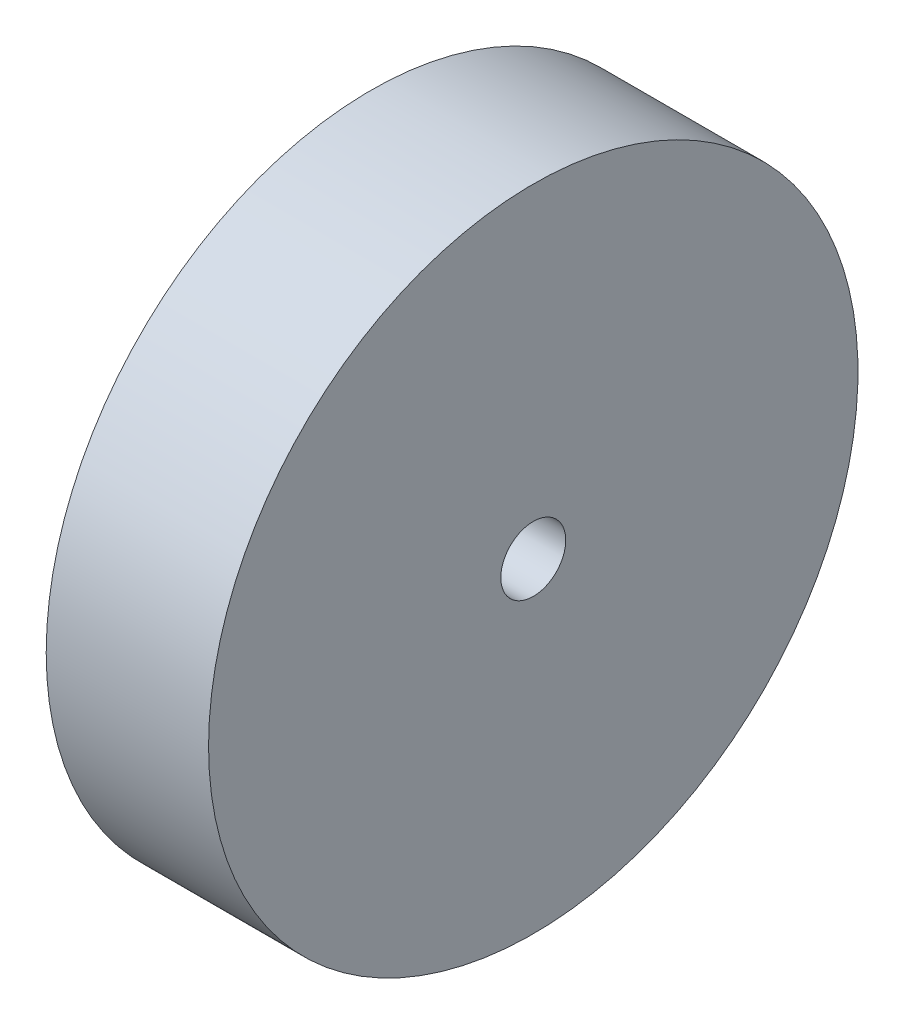
ISO-10303-21;
HEADER;
FILE_DESCRIPTION(('STEP AP214'),'2;1');
FILE_NAME('part.step','',(''),(''),'','','');
FILE_SCHEMA(('AUTOMOTIVE_DESIGN { 1 0 10303 214 1 1 1 1 }'));
ENDSEC;
DATA;
#1=APPLICATION_CONTEXT('core data for automotive mechanical design processes');
#2=APPLICATION_PROTOCOL_DEFINITION('international standard','automotive_design',2000,#1);
#3=PRODUCT_CONTEXT('',#1,'mechanical');
#4=PRODUCT('Part','Part','',(#3));
#5=PRODUCT_RELATED_PRODUCT_CATEGORY('part','',(#4));
#6=PRODUCT_DEFINITION_FORMATION('','',#4);
#7=PRODUCT_DEFINITION_CONTEXT('part definition',#1,'design');
#8=PRODUCT_DEFINITION('design','',#6,#7);
#9=PRODUCT_DEFINITION_SHAPE('','',#8);
#10=(LENGTH_UNIT() NAMED_UNIT(*) SI_UNIT(.MILLI.,.METRE.));
#11=(NAMED_UNIT(*) PLANE_ANGLE_UNIT() SI_UNIT($,.RADIAN.));
#12=(NAMED_UNIT(*) SI_UNIT($,.STERADIAN.) SOLID_ANGLE_UNIT());
#13=UNCERTAINTY_MEASURE_WITH_UNIT(LENGTH_MEASURE(1.E-05),#10,'distance_accuracy_value','');
#14=(GEOMETRIC_REPRESENTATION_CONTEXT(3) GLOBAL_UNCERTAINTY_ASSIGNED_CONTEXT((#13)) GLOBAL_UNIT_ASSIGNED_CONTEXT((#10,
#11,#12)) REPRESENTATION_CONTEXT('',''));
#15=CARTESIAN_POINT('',(0.,0.,0.));
#16=DIRECTION('',(0.,0.,1.));
#17=DIRECTION('',(1.,0.,0.));
#18=AXIS2_PLACEMENT_3D('',#15,#16,#17);
#19=CARTESIAN_POINT('',(-2.5,1.,0.));
#20=DIRECTION('',(1.,0.,0.));
#21=DIRECTION('',(0.,0.,-1.));
#22=AXIS2_PLACEMENT_3D('',#19,#20,#21);
#23=PLANE('',#22);
#24=CARTESIAN_POINT('',(-2.5,0.,0.));
#25=DIRECTION('',(-1.,0.,0.));
#26=DIRECTION('',(0.,0.,1.));
#27=AXIS2_PLACEMENT_3D('',#24,#25,#26);
#28=CIRCLE('',#27,1.);
#29=CARTESIAN_POINT('',(-2.5,0.,1.));
#30=VERTEX_POINT('',#29);
#31=EDGE_CURVE('E54',#30,#30,#28,.T.);
#32=ORIENTED_EDGE('',*,*,#31,.F.);
#33=EDGE_LOOP('',(#32));
#34=FACE_BOUND('',#33,.T.);
#35=CARTESIAN_POINT('',(-2.5,0.,0.));
#36=DIRECTION('',(-1.,0.,0.));
#37=DIRECTION('',(0.,0.,1.));
#38=AXIS2_PLACEMENT_3D('',#35,#36,#37);
#39=CIRCLE('',#38,10.);
#40=CARTESIAN_POINT('',(-2.5,0.,10.));
#41=VERTEX_POINT('',#40);
#42=EDGE_CURVE('E10',#41,#41,#39,.T.);
#43=ORIENTED_EDGE('',*,*,#42,.T.);
#44=EDGE_LOOP('',(#43));
#45=FACE_BOUND('',#44,.T.);
#46=ADVANCED_FACE('F37',(#34,#45),#23,.F.);
#47=CARTESIAN_POINT('',(0.,0.,0.));
#48=DIRECTION('',(-1.,0.,0.));
#49=DIRECTION('',(0.,0.,1.));
#50=AXIS2_PLACEMENT_3D('',#47,#48,#49);
#51=CYLINDRICAL_SURFACE('',#50,10.);
#52=ORIENTED_EDGE('',*,*,#42,.F.);
#53=EDGE_LOOP('',(#52));
#54=FACE_BOUND('',#53,.T.);
#55=CARTESIAN_POINT('',(2.5,0.,0.));
#56=DIRECTION('',(-1.,0.,0.));
#57=DIRECTION('',(0.,0.,1.));
#58=AXIS2_PLACEMENT_3D('',#55,#56,#57);
#59=CIRCLE('',#58,10.);
#60=CARTESIAN_POINT('',(2.5,0.,10.));
#61=VERTEX_POINT('',#60);
#62=EDGE_CURVE('E44',#61,#61,#59,.T.);
#63=ORIENTED_EDGE('',*,*,#62,.T.);
#64=EDGE_LOOP('',(#63));
#65=FACE_BOUND('',#64,.T.);
#66=ADVANCED_FACE('F64',(#54,#65),#51,.T.);
#67=CARTESIAN_POINT('',(2.5,1.,0.));
#68=DIRECTION('',(-1.,0.,0.));
#69=DIRECTION('',(0.,0.,1.));
#70=AXIS2_PLACEMENT_3D('',#67,#68,#69);
#71=PLANE('',#70);
#72=ORIENTED_EDGE('',*,*,#62,.F.);
#73=EDGE_LOOP('',(#72));
#74=FACE_BOUND('',#73,.T.);
#75=CARTESIAN_POINT('',(2.5,0.,0.));
#76=DIRECTION('',(-1.,0.,0.));
#77=DIRECTION('',(0.,0.,1.));
#78=AXIS2_PLACEMENT_3D('',#75,#76,#77);
#79=CIRCLE('',#78,1.);
#80=CARTESIAN_POINT('',(2.5,0.,1.));
#81=VERTEX_POINT('',#80);
#82=EDGE_CURVE('E49',#81,#81,#79,.T.);
#83=ORIENTED_EDGE('',*,*,#82,.T.);
#84=EDGE_LOOP('',(#83));
#85=FACE_BOUND('',#84,.T.);
#86=ADVANCED_FACE('F68',(#74,#85),#71,.F.);
#87=CARTESIAN_POINT('',(0.,0.,0.));
#88=DIRECTION('',(-1.,0.,0.));
#89=DIRECTION('',(0.,0.,1.));
#90=AXIS2_PLACEMENT_3D('',#87,#88,#89);
#91=CYLINDRICAL_SURFACE('',#90,1.);
#92=ORIENTED_EDGE('',*,*,#82,.F.);
#93=EDGE_LOOP('',(#92));
#94=FACE_BOUND('',#93,.T.);
#95=ORIENTED_EDGE('',*,*,#31,.T.);
#96=EDGE_LOOP('',(#95));
#97=FACE_BOUND('',#96,.T.);
#98=ADVANCED_FACE('F61',(#94,#97),#91,.F.);
#99=CLOSED_SHELL('',(#46,#66,#86,#98));
#100=MANIFOLD_SOLID_BREP('B2',#99);
#101=ADVANCED_BREP_SHAPE_REPRESENTATION('',(#18,#100),#14);
#102=SHAPE_DEFINITION_REPRESENTATION(#9,#101);
ENDSEC;
END-ISO-10303-21;
